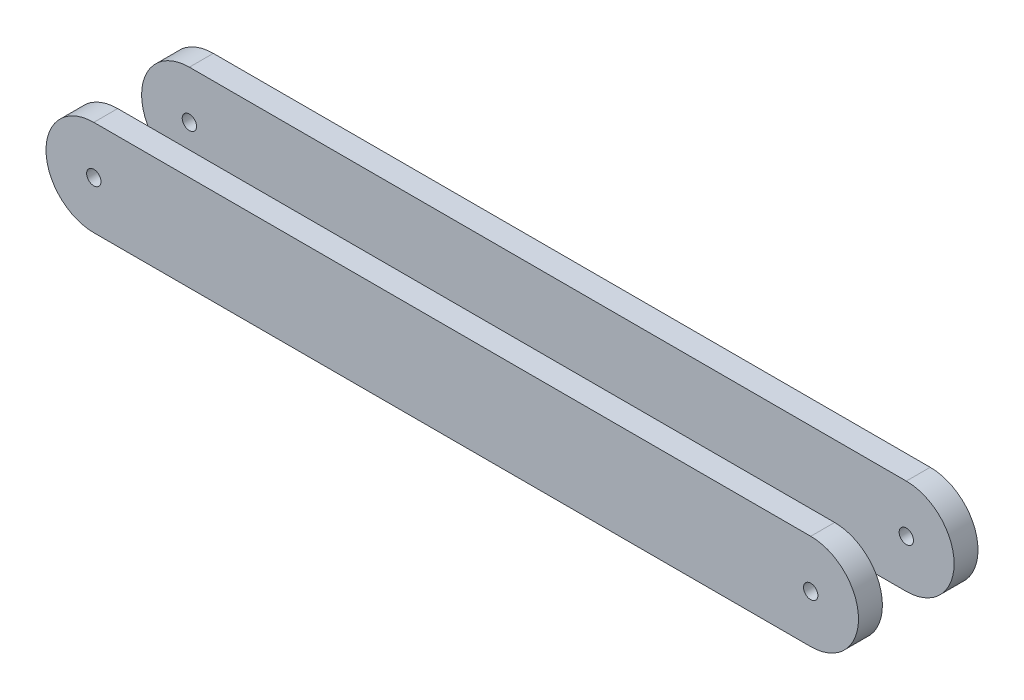
ISO-10303-21;
HEADER;
FILE_DESCRIPTION(('STEP AP214'),'2;1');
FILE_NAME('part.step','',(''),(''),'','','');
FILE_SCHEMA(('AUTOMOTIVE_DESIGN { 1 0 10303 214 1 1 1 1 }'));
ENDSEC;
DATA;
#1=APPLICATION_CONTEXT('core data for automotive mechanical design processes');
#2=APPLICATION_PROTOCOL_DEFINITION('international standard','automotive_design',2000,#1);
#3=PRODUCT_CONTEXT('',#1,'mechanical');
#4=PRODUCT('Part','Part','',(#3));
#5=PRODUCT_RELATED_PRODUCT_CATEGORY('part','',(#4));
#6=PRODUCT_DEFINITION_FORMATION('','',#4);
#7=PRODUCT_DEFINITION_CONTEXT('part definition',#1,'design');
#8=PRODUCT_DEFINITION('design','',#6,#7);
#9=PRODUCT_DEFINITION_SHAPE('','',#8);
#10=(LENGTH_UNIT() NAMED_UNIT(*) SI_UNIT(.MILLI.,.METRE.));
#11=(NAMED_UNIT(*) PLANE_ANGLE_UNIT() SI_UNIT($,.RADIAN.));
#12=(NAMED_UNIT(*) SI_UNIT($,.STERADIAN.) SOLID_ANGLE_UNIT());
#13=UNCERTAINTY_MEASURE_WITH_UNIT(LENGTH_MEASURE(1.E-05),#10,'distance_accuracy_value','');
#14=(GEOMETRIC_REPRESENTATION_CONTEXT(3) GLOBAL_UNCERTAINTY_ASSIGNED_CONTEXT((#13)) GLOBAL_UNIT_ASSIGNED_CONTEXT((#10,
#11,#12)) REPRESENTATION_CONTEXT('',''));
#15=CARTESIAN_POINT('',(0.,0.,0.));
#16=DIRECTION('',(0.,0.,1.));
#17=DIRECTION('',(1.,0.,0.));
#18=AXIS2_PLACEMENT_3D('',#15,#16,#17);
#19=CARTESIAN_POINT('',(-150.,0.,25.));
#20=DIRECTION('',(0.,0.,-1.));
#21=DIRECTION('',(-1.,0.,0.));
#22=AXIS2_PLACEMENT_3D('',#19,#20,#21);
#23=CYLINDRICAL_SURFACE('',#22,10.);
#24=CARTESIAN_POINT('',(-150.,0.,20.));
#25=DIRECTION('',(0.,0.,1.));
#26=DIRECTION('',(1.,0.,0.));
#27=AXIS2_PLACEMENT_3D('',#24,#25,#26);
#28=CIRCLE('',#27,10.);
#29=CARTESIAN_POINT('',(-150.,10.,20.));
#30=VERTEX_POINT('',#29);
#31=CARTESIAN_POINT('',(-150.,-10.,20.));
#32=VERTEX_POINT('',#31);
#33=EDGE_CURVE('P0_E79',#30,#32,#28,.T.);
#34=ORIENTED_EDGE('',*,*,#33,.T.);
#35=DIRECTION('',(0.,0.,-1.));
#36=VECTOR('',#35,1.);
#37=CARTESIAN_POINT('',(-150.,-10.,25.));
#38=LINE('',#37,#36);
#39=CARTESIAN_POINT('',(-150.,-10.,25.));
#40=VERTEX_POINT('',#39);
#41=EDGE_CURVE('P0_E10',#40,#32,#38,.T.);
#42=ORIENTED_EDGE('',*,*,#41,.F.);
#43=CARTESIAN_POINT('',(-150.,0.,25.));
#44=DIRECTION('',(0.,0.,1.));
#45=DIRECTION('',(1.,0.,0.));
#46=AXIS2_PLACEMENT_3D('',#43,#44,#45);
#47=CIRCLE('',#46,10.);
#48=CARTESIAN_POINT('',(-150.,10.,25.));
#49=VERTEX_POINT('',#48);
#50=EDGE_CURVE('P0_E67',#49,#40,#47,.T.);
#51=ORIENTED_EDGE('',*,*,#50,.F.);
#52=DIRECTION('',(0.,0.,-1.));
#53=VECTOR('',#52,1.);
#54=CARTESIAN_POINT('',(-150.,10.,25.));
#55=LINE('',#54,#53);
#56=EDGE_CURVE('P0_E75',#49,#30,#55,.T.);
#57=ORIENTED_EDGE('',*,*,#56,.T.);
#58=EDGE_LOOP('',(#34,#42,#51,#57));
#59=FACE_BOUND('',#58,.T.);
#60=ADVANCED_FACE('P0_F16',(#59),#23,.T.);
#61=CARTESIAN_POINT('',(-150.,-10.,25.));
#62=DIRECTION('',(0.,1.,0.));
#63=DIRECTION('',(0.,0.,1.));
#64=AXIS2_PLACEMENT_3D('',#61,#62,#63);
#65=PLANE('',#64);
#66=DIRECTION('',(1.,0.,0.));
#67=VECTOR('',#66,1.);
#68=CARTESIAN_POINT('',(-150.,-10.,20.));
#69=LINE('',#68,#67);
#70=CARTESIAN_POINT('',(0.,-10.,20.));
#71=VERTEX_POINT('',#70);
#72=EDGE_CURVE('P0_E71',#32,#71,#69,.T.);
#73=ORIENTED_EDGE('',*,*,#72,.T.);
#74=DIRECTION('',(0.,0.,-1.));
#75=VECTOR('',#74,1.);
#76=CARTESIAN_POINT('',(0.,-10.,25.));
#77=LINE('',#76,#75);
#78=CARTESIAN_POINT('',(0.,-10.,25.));
#79=VERTEX_POINT('',#78);
#80=EDGE_CURVE('P0_E24',#79,#71,#77,.T.);
#81=ORIENTED_EDGE('',*,*,#80,.F.);
#82=DIRECTION('',(1.,0.,0.));
#83=VECTOR('',#82,1.);
#84=CARTESIAN_POINT('',(-150.,-10.,25.));
#85=LINE('',#84,#83);
#86=EDGE_CURVE('P0_E62',#40,#79,#85,.T.);
#87=ORIENTED_EDGE('',*,*,#86,.F.);
#88=ORIENTED_EDGE('',*,*,#41,.T.);
#89=EDGE_LOOP('',(#73,#81,#87,#88));
#90=FACE_BOUND('',#89,.T.);
#91=ADVANCED_FACE('P0_F70',(#90),#65,.F.);
#92=CARTESIAN_POINT('',(0.,0.,25.));
#93=DIRECTION('',(0.,0.,-1.));
#94=DIRECTION('',(-1.,0.,0.));
#95=AXIS2_PLACEMENT_3D('',#92,#93,#94);
#96=CYLINDRICAL_SURFACE('',#95,10.);
#97=CARTESIAN_POINT('',(0.,0.,20.));
#98=DIRECTION('',(0.,0.,1.));
#99=DIRECTION('',(1.,0.,0.));
#100=AXIS2_PLACEMENT_3D('',#97,#98,#99);
#101=CIRCLE('',#100,10.);
#102=CARTESIAN_POINT('',(0.,10.,20.));
#103=VERTEX_POINT('',#102);
#104=EDGE_CURVE('P0_E49',#71,#103,#101,.T.);
#105=ORIENTED_EDGE('',*,*,#104,.T.);
#106=DIRECTION('',(0.,0.,-1.));
#107=VECTOR('',#106,1.);
#108=CARTESIAN_POINT('',(0.,10.,25.));
#109=LINE('',#108,#107);
#110=CARTESIAN_POINT('',(0.,10.,25.));
#111=VERTEX_POINT('',#110);
#112=EDGE_CURVE('P0_E72',#111,#103,#109,.T.);
#113=ORIENTED_EDGE('',*,*,#112,.F.);
#114=CARTESIAN_POINT('',(0.,0.,25.));
#115=DIRECTION('',(0.,0.,1.));
#116=DIRECTION('',(1.,0.,0.));
#117=AXIS2_PLACEMENT_3D('',#114,#115,#116);
#118=CIRCLE('',#117,10.);
#119=EDGE_CURVE('P0_E65',#79,#111,#118,.T.);
#120=ORIENTED_EDGE('',*,*,#119,.F.);
#121=ORIENTED_EDGE('',*,*,#80,.T.);
#122=EDGE_LOOP('',(#105,#113,#120,#121));
#123=FACE_BOUND('',#122,.T.);
#124=ADVANCED_FACE('P0_F73',(#123),#96,.T.);
#125=CARTESIAN_POINT('',(-150.,10.,25.));
#126=DIRECTION('',(0.,-1.,0.));
#127=DIRECTION('',(0.,0.,-1.));
#128=AXIS2_PLACEMENT_3D('',#125,#126,#127);
#129=PLANE('',#128);
#130=DIRECTION('',(-1.,0.,0.));
#131=VECTOR('',#130,1.);
#132=CARTESIAN_POINT('',(-150.,10.,20.));
#133=LINE('',#132,#131);
#134=EDGE_CURVE('P0_E55',#103,#30,#133,.T.);
#135=ORIENTED_EDGE('',*,*,#134,.T.);
#136=ORIENTED_EDGE('',*,*,#56,.F.);
#137=DIRECTION('',(-1.,0.,0.));
#138=VECTOR('',#137,1.);
#139=CARTESIAN_POINT('',(-150.,10.,25.));
#140=LINE('',#139,#138);
#141=EDGE_CURVE('P0_E32',#111,#49,#140,.T.);
#142=ORIENTED_EDGE('',*,*,#141,.F.);
#143=ORIENTED_EDGE('',*,*,#112,.T.);
#144=EDGE_LOOP('',(#135,#136,#142,#143));
#145=FACE_BOUND('',#144,.T.);
#146=ADVANCED_FACE('P0_F87',(#145),#129,.F.);
#147=CARTESIAN_POINT('',(-150.,0.,25.));
#148=DIRECTION('',(0.,0.,1.));
#149=DIRECTION('',(1.,0.,0.));
#150=AXIS2_PLACEMENT_3D('',#147,#148,#149);
#151=PLANE('',#150);
#152=CARTESIAN_POINT('',(-150.,0.,25.));
#153=DIRECTION('',(0.,0.,-1.));
#154=DIRECTION('',(-1.,0.,0.));
#155=AXIS2_PLACEMENT_3D('',#152,#153,#154);
#156=CIRCLE('',#155,1.5);
#157=CARTESIAN_POINT('',(-151.5,0.,25.));
#158=VERTEX_POINT('',#157);
#159=EDGE_CURVE('P0_E82',#158,#158,#156,.T.);
#160=ORIENTED_EDGE('',*,*,#159,.T.);
#161=EDGE_LOOP('',(#160));
#162=FACE_BOUND('',#161,.T.);
#163=CARTESIAN_POINT('',(0.,0.,25.));
#164=DIRECTION('',(0.,0.,-1.));
#165=DIRECTION('',(-1.,0.,0.));
#166=AXIS2_PLACEMENT_3D('',#163,#164,#165);
#167=CIRCLE('',#166,1.5);
#168=CARTESIAN_POINT('',(-1.5,0.,25.));
#169=VERTEX_POINT('',#168);
#170=EDGE_CURVE('P0_E96',#169,#169,#167,.T.);
#171=ORIENTED_EDGE('',*,*,#170,.T.);
#172=EDGE_LOOP('',(#171));
#173=FACE_BOUND('',#172,.T.);
#174=ORIENTED_EDGE('',*,*,#50,.T.);
#175=ORIENTED_EDGE('',*,*,#86,.T.);
#176=ORIENTED_EDGE('',*,*,#119,.T.);
#177=ORIENTED_EDGE('',*,*,#141,.T.);
#178=EDGE_LOOP('',(#174,#175,#176,#177));
#179=FACE_BOUND('',#178,.T.);
#180=ADVANCED_FACE('P0_F63',(#162,#173,#179),#151,.T.);
#181=CARTESIAN_POINT('',(-150.,0.,20.));
#182=DIRECTION('',(0.,0.,1.));
#183=DIRECTION('',(1.,0.,0.));
#184=AXIS2_PLACEMENT_3D('',#181,#182,#183);
#185=PLANE('',#184);
#186=CARTESIAN_POINT('',(-150.,0.,20.));
#187=DIRECTION('',(0.,0.,-1.));
#188=DIRECTION('',(-1.,0.,0.));
#189=AXIS2_PLACEMENT_3D('',#186,#187,#188);
#190=CIRCLE('',#189,1.5);
#191=CARTESIAN_POINT('',(-151.5,0.,20.));
#192=VERTEX_POINT('',#191);
#193=EDGE_CURVE('P0_E99',#192,#192,#190,.T.);
#194=ORIENTED_EDGE('',*,*,#193,.F.);
#195=EDGE_LOOP('',(#194));
#196=FACE_BOUND('',#195,.T.);
#197=CARTESIAN_POINT('',(0.,0.,20.));
#198=DIRECTION('',(0.,0.,-1.));
#199=DIRECTION('',(-1.,0.,0.));
#200=AXIS2_PLACEMENT_3D('',#197,#198,#199);
#201=CIRCLE('',#200,1.5);
#202=CARTESIAN_POINT('',(-1.5,0.,20.));
#203=VERTEX_POINT('',#202);
#204=EDGE_CURVE('P0_E93',#203,#203,#201,.T.);
#205=ORIENTED_EDGE('',*,*,#204,.F.);
#206=EDGE_LOOP('',(#205));
#207=FACE_BOUND('',#206,.T.);
#208=ORIENTED_EDGE('',*,*,#33,.F.);
#209=ORIENTED_EDGE('',*,*,#134,.F.);
#210=ORIENTED_EDGE('',*,*,#104,.F.);
#211=ORIENTED_EDGE('',*,*,#72,.F.);
#212=EDGE_LOOP('',(#208,#209,#210,#211));
#213=FACE_BOUND('',#212,.T.);
#214=ADVANCED_FACE('P0_F90',(#196,#207,#213),#185,.F.);
#215=CARTESIAN_POINT('',(0.,0.,25.));
#216=DIRECTION('',(0.,0.,-1.));
#217=DIRECTION('',(-1.,0.,0.));
#218=AXIS2_PLACEMENT_3D('',#215,#216,#217);
#219=CYLINDRICAL_SURFACE('',#218,1.5);
#220=ORIENTED_EDGE('',*,*,#170,.F.);
#221=EDGE_LOOP('',(#220));
#222=FACE_BOUND('',#221,.T.);
#223=ORIENTED_EDGE('',*,*,#204,.T.);
#224=EDGE_LOOP('',(#223));
#225=FACE_BOUND('',#224,.T.);
#226=ADVANCED_FACE('P0_F110',(#222,#225),#219,.F.);
#227=CARTESIAN_POINT('',(-150.,0.,25.));
#228=DIRECTION('',(0.,0.,-1.));
#229=DIRECTION('',(-1.,0.,0.));
#230=AXIS2_PLACEMENT_3D('',#227,#228,#229);
#231=CYLINDRICAL_SURFACE('',#230,1.5);
#232=ORIENTED_EDGE('',*,*,#159,.F.);
#233=EDGE_LOOP('',(#232));
#234=FACE_BOUND('',#233,.T.);
#235=ORIENTED_EDGE('',*,*,#193,.T.);
#236=EDGE_LOOP('',(#235));
#237=FACE_BOUND('',#236,.T.);
#238=ADVANCED_FACE('P0_F107',(#234,#237),#231,.F.);
#239=CLOSED_SHELL('',(#60,#91,#124,#146,#180,#214,#226,#238));
#240=MANIFOLD_SOLID_BREP('P0_B1',#239);
#241=CARTESIAN_POINT('',(-150.,0.,5.));
#242=DIRECTION('',(0.,0.,-1.));
#243=DIRECTION('',(-1.,0.,0.));
#244=AXIS2_PLACEMENT_3D('',#241,#242,#243);
#245=CYLINDRICAL_SURFACE('',#244,10.);
#246=CARTESIAN_POINT('',(-150.,0.,0.));
#247=DIRECTION('',(0.,0.,1.));
#248=DIRECTION('',(1.,0.,0.));
#249=AXIS2_PLACEMENT_3D('',#246,#247,#248);
#250=CIRCLE('',#249,10.);
#251=CARTESIAN_POINT('',(-150.,10.,0.));
#252=VERTEX_POINT('',#251);
#253=CARTESIAN_POINT('',(-150.,-10.,0.));
#254=VERTEX_POINT('',#253);
#255=EDGE_CURVE('P1_E80',#252,#254,#250,.T.);
#256=ORIENTED_EDGE('',*,*,#255,.T.);
#257=DIRECTION('',(0.,0.,-1.));
#258=VECTOR('',#257,1.);
#259=CARTESIAN_POINT('',(-150.,-10.,5.));
#260=LINE('',#259,#258);
#261=CARTESIAN_POINT('',(-150.,-10.,5.));
#262=VERTEX_POINT('',#261);
#263=EDGE_CURVE('P1_E11',#262,#254,#260,.T.);
#264=ORIENTED_EDGE('',*,*,#263,.F.);
#265=CARTESIAN_POINT('',(-150.,0.,5.));
#266=DIRECTION('',(0.,0.,1.));
#267=DIRECTION('',(1.,0.,0.));
#268=AXIS2_PLACEMENT_3D('',#265,#266,#267);
#269=CIRCLE('',#268,10.);
#270=CARTESIAN_POINT('',(-150.,10.,5.));
#271=VERTEX_POINT('',#270);
#272=EDGE_CURVE('P1_E68',#271,#262,#269,.T.);
#273=ORIENTED_EDGE('',*,*,#272,.F.);
#274=DIRECTION('',(0.,0.,-1.));
#275=VECTOR('',#274,1.);
#276=CARTESIAN_POINT('',(-150.,10.,5.));
#277=LINE('',#276,#275);
#278=EDGE_CURVE('P1_E76',#271,#252,#277,.T.);
#279=ORIENTED_EDGE('',*,*,#278,.T.);
#280=EDGE_LOOP('',(#256,#264,#273,#279));
#281=FACE_BOUND('',#280,.T.);
#282=ADVANCED_FACE('P1_F17',(#281),#245,.T.);
#283=CARTESIAN_POINT('',(-150.,-10.,5.));
#284=DIRECTION('',(0.,1.,0.));
#285=DIRECTION('',(0.,0.,1.));
#286=AXIS2_PLACEMENT_3D('',#283,#284,#285);
#287=PLANE('',#286);
#288=DIRECTION('',(1.,0.,0.));
#289=VECTOR('',#288,1.);
#290=CARTESIAN_POINT('',(-150.,-10.,0.));
#291=LINE('',#290,#289);
#292=CARTESIAN_POINT('',(0.,-10.,0.));
#293=VERTEX_POINT('',#292);
#294=EDGE_CURVE('P1_E72',#254,#293,#291,.T.);
#295=ORIENTED_EDGE('',*,*,#294,.T.);
#296=DIRECTION('',(0.,0.,-1.));
#297=VECTOR('',#296,1.);
#298=CARTESIAN_POINT('',(0.,-10.,5.));
#299=LINE('',#298,#297);
#300=CARTESIAN_POINT('',(0.,-10.,5.));
#301=VERTEX_POINT('',#300);
#302=EDGE_CURVE('P1_E25',#301,#293,#299,.T.);
#303=ORIENTED_EDGE('',*,*,#302,.F.);
#304=DIRECTION('',(1.,0.,0.));
#305=VECTOR('',#304,1.);
#306=CARTESIAN_POINT('',(-150.,-10.,5.));
#307=LINE('',#306,#305);
#308=EDGE_CURVE('P1_E63',#262,#301,#307,.T.);
#309=ORIENTED_EDGE('',*,*,#308,.F.);
#310=ORIENTED_EDGE('',*,*,#263,.T.);
#311=EDGE_LOOP('',(#295,#303,#309,#310));
#312=FACE_BOUND('',#311,.T.);
#313=ADVANCED_FACE('P1_F71',(#312),#287,.F.);
#314=CARTESIAN_POINT('',(0.,0.,5.));
#315=DIRECTION('',(0.,0.,-1.));
#316=DIRECTION('',(-1.,0.,0.));
#317=AXIS2_PLACEMENT_3D('',#314,#315,#316);
#318=CYLINDRICAL_SURFACE('',#317,10.);
#319=CARTESIAN_POINT('',(0.,0.,0.));
#320=DIRECTION('',(0.,0.,1.));
#321=DIRECTION('',(1.,0.,0.));
#322=AXIS2_PLACEMENT_3D('',#319,#320,#321);
#323=CIRCLE('',#322,10.);
#324=CARTESIAN_POINT('',(0.,10.,0.));
#325=VERTEX_POINT('',#324);
#326=EDGE_CURVE('P1_E50',#293,#325,#323,.T.);
#327=ORIENTED_EDGE('',*,*,#326,.T.);
#328=DIRECTION('',(0.,0.,-1.));
#329=VECTOR('',#328,1.);
#330=CARTESIAN_POINT('',(0.,10.,5.));
#331=LINE('',#330,#329);
#332=CARTESIAN_POINT('',(0.,10.,5.));
#333=VERTEX_POINT('',#332);
#334=EDGE_CURVE('P1_E73',#333,#325,#331,.T.);
#335=ORIENTED_EDGE('',*,*,#334,.F.);
#336=CARTESIAN_POINT('',(0.,0.,5.));
#337=DIRECTION('',(0.,0.,1.));
#338=DIRECTION('',(1.,0.,0.));
#339=AXIS2_PLACEMENT_3D('',#336,#337,#338);
#340=CIRCLE('',#339,10.);
#341=EDGE_CURVE('P1_E66',#301,#333,#340,.T.);
#342=ORIENTED_EDGE('',*,*,#341,.F.);
#343=ORIENTED_EDGE('',*,*,#302,.T.);
#344=EDGE_LOOP('',(#327,#335,#342,#343));
#345=FACE_BOUND('',#344,.T.);
#346=ADVANCED_FACE('P1_F74',(#345),#318,.T.);
#347=CARTESIAN_POINT('',(-150.,10.,5.));
#348=DIRECTION('',(0.,-1.,0.));
#349=DIRECTION('',(0.,0.,-1.));
#350=AXIS2_PLACEMENT_3D('',#347,#348,#349);
#351=PLANE('',#350);
#352=DIRECTION('',(-1.,0.,0.));
#353=VECTOR('',#352,1.);
#354=CARTESIAN_POINT('',(-150.,10.,0.));
#355=LINE('',#354,#353);
#356=EDGE_CURVE('P1_E56',#325,#252,#355,.T.);
#357=ORIENTED_EDGE('',*,*,#356,.T.);
#358=ORIENTED_EDGE('',*,*,#278,.F.);
#359=DIRECTION('',(-1.,0.,0.));
#360=VECTOR('',#359,1.);
#361=CARTESIAN_POINT('',(-150.,10.,5.));
#362=LINE('',#361,#360);
#363=EDGE_CURVE('P1_E33',#333,#271,#362,.T.);
#364=ORIENTED_EDGE('',*,*,#363,.F.);
#365=ORIENTED_EDGE('',*,*,#334,.T.);
#366=EDGE_LOOP('',(#357,#358,#364,#365));
#367=FACE_BOUND('',#366,.T.);
#368=ADVANCED_FACE('P1_F88',(#367),#351,.F.);
#369=CARTESIAN_POINT('',(-150.,0.,5.));
#370=DIRECTION('',(0.,0.,1.));
#371=DIRECTION('',(1.,0.,0.));
#372=AXIS2_PLACEMENT_3D('',#369,#370,#371);
#373=PLANE('',#372);
#374=CARTESIAN_POINT('',(-150.,0.,5.));
#375=DIRECTION('',(0.,0.,-1.));
#376=DIRECTION('',(-1.,0.,0.));
#377=AXIS2_PLACEMENT_3D('',#374,#375,#376);
#378=CIRCLE('',#377,1.5);
#379=CARTESIAN_POINT('',(-151.5,0.,5.));
#380=VERTEX_POINT('',#379);
#381=EDGE_CURVE('P1_E83',#380,#380,#378,.T.);
#382=ORIENTED_EDGE('',*,*,#381,.T.);
#383=EDGE_LOOP('',(#382));
#384=FACE_BOUND('',#383,.T.);
#385=CARTESIAN_POINT('',(0.,0.,5.));
#386=DIRECTION('',(0.,0.,-1.));
#387=DIRECTION('',(-1.,0.,0.));
#388=AXIS2_PLACEMENT_3D('',#385,#386,#387);
#389=CIRCLE('',#388,1.5);
#390=CARTESIAN_POINT('',(-1.5,0.,5.));
#391=VERTEX_POINT('',#390);
#392=EDGE_CURVE('P1_E97',#391,#391,#389,.T.);
#393=ORIENTED_EDGE('',*,*,#392,.T.);
#394=EDGE_LOOP('',(#393));
#395=FACE_BOUND('',#394,.T.);
#396=ORIENTED_EDGE('',*,*,#272,.T.);
#397=ORIENTED_EDGE('',*,*,#308,.T.);
#398=ORIENTED_EDGE('',*,*,#341,.T.);
#399=ORIENTED_EDGE('',*,*,#363,.T.);
#400=EDGE_LOOP('',(#396,#397,#398,#399));
#401=FACE_BOUND('',#400,.T.);
#402=ADVANCED_FACE('P1_F64',(#384,#395,#401),#373,.T.);
#403=CARTESIAN_POINT('',(-150.,0.,0.));
#404=DIRECTION('',(0.,0.,1.));
#405=DIRECTION('',(1.,0.,0.));
#406=AXIS2_PLACEMENT_3D('',#403,#404,#405);
#407=PLANE('',#406);
#408=CARTESIAN_POINT('',(-150.,0.,0.));
#409=DIRECTION('',(0.,0.,-1.));
#410=DIRECTION('',(-1.,0.,0.));
#411=AXIS2_PLACEMENT_3D('',#408,#409,#410);
#412=CIRCLE('',#411,1.5);
#413=CARTESIAN_POINT('',(-151.5,0.,0.));
#414=VERTEX_POINT('',#413);
#415=EDGE_CURVE('P1_E100',#414,#414,#412,.T.);
#416=ORIENTED_EDGE('',*,*,#415,.F.);
#417=EDGE_LOOP('',(#416));
#418=FACE_BOUND('',#417,.T.);
#419=CARTESIAN_POINT('',(0.,0.,0.));
#420=DIRECTION('',(0.,0.,-1.));
#421=DIRECTION('',(-1.,0.,0.));
#422=AXIS2_PLACEMENT_3D('',#419,#420,#421);
#423=CIRCLE('',#422,1.5);
#424=CARTESIAN_POINT('',(-1.5,0.,0.));
#425=VERTEX_POINT('',#424);
#426=EDGE_CURVE('P1_E94',#425,#425,#423,.T.);
#427=ORIENTED_EDGE('',*,*,#426,.F.);
#428=EDGE_LOOP('',(#427));
#429=FACE_BOUND('',#428,.T.);
#430=ORIENTED_EDGE('',*,*,#255,.F.);
#431=ORIENTED_EDGE('',*,*,#356,.F.);
#432=ORIENTED_EDGE('',*,*,#326,.F.);
#433=ORIENTED_EDGE('',*,*,#294,.F.);
#434=EDGE_LOOP('',(#430,#431,#432,#433));
#435=FACE_BOUND('',#434,.T.);
#436=ADVANCED_FACE('P1_F91',(#418,#429,#435),#407,.F.);
#437=CARTESIAN_POINT('',(0.,0.,5.));
#438=DIRECTION('',(0.,0.,-1.));
#439=DIRECTION('',(-1.,0.,0.));
#440=AXIS2_PLACEMENT_3D('',#437,#438,#439);
#441=CYLINDRICAL_SURFACE('',#440,1.5);
#442=ORIENTED_EDGE('',*,*,#392,.F.);
#443=EDGE_LOOP('',(#442));
#444=FACE_BOUND('',#443,.T.);
#445=ORIENTED_EDGE('',*,*,#426,.T.);
#446=EDGE_LOOP('',(#445));
#447=FACE_BOUND('',#446,.T.);
#448=ADVANCED_FACE('P1_F111',(#444,#447),#441,.F.);
#449=CARTESIAN_POINT('',(-150.,0.,5.));
#450=DIRECTION('',(0.,0.,-1.));
#451=DIRECTION('',(-1.,0.,0.));
#452=AXIS2_PLACEMENT_3D('',#449,#450,#451);
#453=CYLINDRICAL_SURFACE('',#452,1.5);
#454=ORIENTED_EDGE('',*,*,#381,.F.);
#455=EDGE_LOOP('',(#454));
#456=FACE_BOUND('',#455,.T.);
#457=ORIENTED_EDGE('',*,*,#415,.T.);
#458=EDGE_LOOP('',(#457));
#459=FACE_BOUND('',#458,.T.);
#460=ADVANCED_FACE('P1_F108',(#456,#459),#453,.F.);
#461=CLOSED_SHELL('',(#282,#313,#346,#368,#402,#436,#448,#460));
#462=MANIFOLD_SOLID_BREP('P1_B1',#461);
#463=ADVANCED_BREP_SHAPE_REPRESENTATION('',(#18,#240,#462),#14);
#464=SHAPE_DEFINITION_REPRESENTATION(#9,#463);
ENDSEC;
END-ISO-10303-21;
